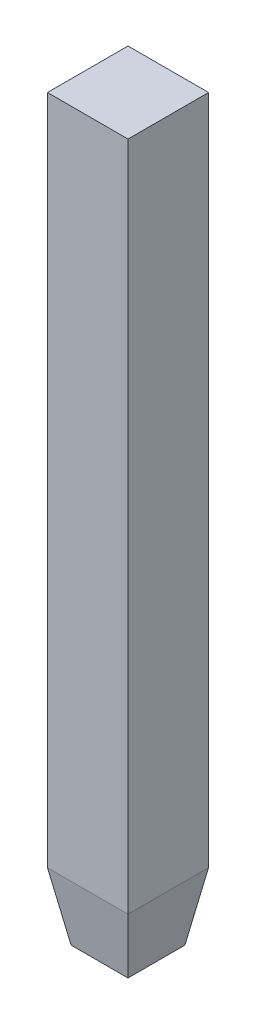
ISO-10303-21;
HEADER;
FILE_DESCRIPTION(('STEP AP214'),'2;1');
FILE_NAME('part.step','',(''),(''),'','','');
FILE_SCHEMA(('AUTOMOTIVE_DESIGN { 1 0 10303 214 1 1 1 1 }'));
ENDSEC;
DATA;
#1=APPLICATION_CONTEXT('core data for automotive mechanical design processes');
#2=APPLICATION_PROTOCOL_DEFINITION('international standard','automotive_design',2000,#1);
#3=PRODUCT_CONTEXT('',#1,'mechanical');
#4=PRODUCT('Part','Part','',(#3));
#5=PRODUCT_RELATED_PRODUCT_CATEGORY('part','',(#4));
#6=PRODUCT_DEFINITION_FORMATION('','',#4);
#7=PRODUCT_DEFINITION_CONTEXT('part definition',#1,'design');
#8=PRODUCT_DEFINITION('design','',#6,#7);
#9=PRODUCT_DEFINITION_SHAPE('','',#8);
#10=(LENGTH_UNIT() NAMED_UNIT(*) SI_UNIT(.MILLI.,.METRE.));
#11=(NAMED_UNIT(*) PLANE_ANGLE_UNIT() SI_UNIT($,.RADIAN.));
#12=(NAMED_UNIT(*) SI_UNIT($,.STERADIAN.) SOLID_ANGLE_UNIT());
#13=UNCERTAINTY_MEASURE_WITH_UNIT(LENGTH_MEASURE(1.E-05),#10,'distance_accuracy_value','');
#14=(GEOMETRIC_REPRESENTATION_CONTEXT(3) GLOBAL_UNCERTAINTY_ASSIGNED_CONTEXT((#13)) GLOBAL_UNIT_ASSIGNED_CONTEXT((#10,
#11,#12)) REPRESENTATION_CONTEXT('',''));
#15=CARTESIAN_POINT('',(0.,0.,0.));
#16=DIRECTION('',(0.,0.,1.));
#17=DIRECTION('',(1.,0.,0.));
#18=AXIS2_PLACEMENT_3D('',#15,#16,#17);
#19=CARTESIAN_POINT('',(9.263525857829,0.5,28.886040012214));
#20=DIRECTION('',(-0.98480775301219,-0.173648177667033,0.));
#21=DIRECTION('',(0.173648177667033,-0.98480775301219,0.));
#22=AXIS2_PLACEMENT_3D('',#19,#20,#21);
#23=PLANE('',#22);
#24=DIRECTION('',(0.17108786974561,-0.970287525247869,-0.171087869746148));
#25=VECTOR('',#24,1.);
#26=CARTESIAN_POINT('',(9.263525857829,0.5,28.886040012214));
#27=LINE('',#26,#25);
#28=CARTESIAN_POINT('',(9.263525857829,0.5,28.886040012214));
#29=VERTEX_POINT('',#28);
#30=CARTESIAN_POINT('',(9.35168934818314,0.,28.7978765218599));
#31=VERTEX_POINT('',#30);
#32=EDGE_CURVE('E66',#29,#31,#27,.T.);
#33=ORIENTED_EDGE('',*,*,#32,.F.);
#34=DIRECTION('',(0.,0.,-1.));
#35=VECTOR('',#34,1.);
#36=CARTESIAN_POINT('',(9.263525857829,0.5,28.886040012214));
#37=LINE('',#36,#35);
#38=CARTESIAN_POINT('',(9.263525857829,0.5,28.286040012214));
#39=VERTEX_POINT('',#38);
#40=EDGE_CURVE('E86',#29,#39,#37,.T.);
#41=ORIENTED_EDGE('',*,*,#40,.T.);
#42=DIRECTION('',(-0.171087869745609,0.970287525247869,-0.171087869746148));
#43=VECTOR('',#42,1.);
#44=CARTESIAN_POINT('',(9.351689348183,0.,28.3742035025683));
#45=LINE('',#44,#43);
#46=CARTESIAN_POINT('',(9.35168934818307,0.,28.3742035025681));
#47=VERTEX_POINT('',#46);
#48=EDGE_CURVE('E83',#47,#39,#45,.T.);
#49=ORIENTED_EDGE('',*,*,#48,.F.);
#50=DIRECTION('',(0.,0.,-1.));
#51=VECTOR('',#50,1.);
#52=CARTESIAN_POINT('',(9.351689348183,0.,0.));
#53=LINE('',#52,#51);
#54=EDGE_CURVE('E20',#31,#47,#53,.T.);
#55=ORIENTED_EDGE('',*,*,#54,.F.);
#56=EDGE_LOOP('',(#33,#41,#49,#55));
#57=FACE_BOUND('',#56,.T.);
#58=ADVANCED_FACE('F17',(#57),#23,.T.);
#59=CARTESIAN_POINT('',(0.,0.,0.));
#60=DIRECTION('',(0.,-1.,0.));
#61=DIRECTION('',(0.,0.,-1.));
#62=AXIS2_PLACEMENT_3D('',#59,#60,#61);
#63=PLANE('',#62);
#64=DIRECTION('',(1.,0.,0.));
#65=VECTOR('',#64,1.);
#66=CARTESIAN_POINT('',(9.263525857829,0.,28.3742035025683));
#67=LINE('',#66,#65);
#68=CARTESIAN_POINT('',(9.77536236747493,0.,28.3742035025681));
#69=VERTEX_POINT('',#68);
#70=EDGE_CURVE('E75',#69,#47,#67,.F.);
#71=ORIENTED_EDGE('',*,*,#70,.F.);
#72=DIRECTION('',(0.,0.,1.));
#73=VECTOR('',#72,1.);
#74=CARTESIAN_POINT('',(9.77536236747472,0.,28.886040012214));
#75=LINE('',#74,#73);
#76=CARTESIAN_POINT('',(9.77536236747493,0.,28.7978765218599));
#77=VERTEX_POINT('',#76);
#78=EDGE_CURVE('E106',#77,#69,#75,.F.);
#79=ORIENTED_EDGE('',*,*,#78,.F.);
#80=DIRECTION('',(1.,0.,0.));
#81=VECTOR('',#80,1.);
#82=CARTESIAN_POINT('',(9.263525857829,0.,28.7978765218597));
#83=LINE('',#82,#81);
#84=EDGE_CURVE('E77',#31,#77,#83,.T.);
#85=ORIENTED_EDGE('',*,*,#84,.F.);
#86=ORIENTED_EDGE('',*,*,#54,.T.);
#87=EDGE_LOOP('',(#71,#79,#85,#86));
#88=FACE_BOUND('',#87,.T.);
#89=ADVANCED_FACE('F73',(#88),#63,.T.);
#90=CARTESIAN_POINT('',(9.263525857829,0.5,28.286040012214));
#91=DIRECTION('',(0.,-0.173648177667033,-0.98480775301219));
#92=DIRECTION('',(0.,0.98480775301219,-0.173648177667033));
#93=AXIS2_PLACEMENT_3D('',#90,#91,#92);
#94=PLANE('',#93);
#95=ORIENTED_EDGE('',*,*,#48,.T.);
#96=DIRECTION('',(1.,0.,0.));
#97=VECTOR('',#96,1.);
#98=CARTESIAN_POINT('',(9.263525857829,0.5,28.286040012214));
#99=LINE('',#98,#97);
#100=CARTESIAN_POINT('',(9.863525857829,0.5,28.286040012214));
#101=VERTEX_POINT('',#100);
#102=EDGE_CURVE('E101',#39,#101,#99,.T.);
#103=ORIENTED_EDGE('',*,*,#102,.T.);
#104=DIRECTION('',(0.171087869746151,0.970287525247868,-0.171087869745616));
#105=VECTOR('',#104,1.);
#106=CARTESIAN_POINT('',(9.77536236747472,0.,28.374203502568));
#107=LINE('',#106,#105);
#108=EDGE_CURVE('E85',#69,#101,#107,.T.);
#109=ORIENTED_EDGE('',*,*,#108,.F.);
#110=ORIENTED_EDGE('',*,*,#70,.T.);
#111=EDGE_LOOP('',(#95,#103,#109,#110));
#112=FACE_BOUND('',#111,.T.);
#113=ADVANCED_FACE('F81',(#112),#94,.T.);
#114=CARTESIAN_POINT('',(9.263525857829,0.5,28.886040012214));
#115=DIRECTION('',(0.,-0.173648177667033,0.98480775301219));
#116=DIRECTION('',(0.,-0.98480775301219,-0.173648177667033));
#117=AXIS2_PLACEMENT_3D('',#114,#115,#116);
#118=PLANE('',#117);
#119=ORIENTED_EDGE('',*,*,#32,.T.);
#120=ORIENTED_EDGE('',*,*,#84,.T.);
#121=DIRECTION('',(-0.171087869746151,-0.97028752524787,-0.171087869745603));
#122=VECTOR('',#121,1.);
#123=CARTESIAN_POINT('',(9.863525857829,0.5,28.886040012214));
#124=LINE('',#123,#122);
#125=CARTESIAN_POINT('',(9.863525857829,0.5,28.886040012214));
#126=VERTEX_POINT('',#125);
#127=EDGE_CURVE('E103',#126,#77,#124,.T.);
#128=ORIENTED_EDGE('',*,*,#127,.F.);
#129=DIRECTION('',(-1.,0.,0.));
#130=VECTOR('',#129,1.);
#131=CARTESIAN_POINT('',(9.263525857829,0.5,28.886040012214));
#132=LINE('',#131,#130);
#133=EDGE_CURVE('E34',#126,#29,#132,.T.);
#134=ORIENTED_EDGE('',*,*,#133,.T.);
#135=EDGE_LOOP('',(#119,#120,#128,#134));
#136=FACE_BOUND('',#135,.T.);
#137=ADVANCED_FACE('F154',(#136),#118,.T.);
#138=CARTESIAN_POINT('',(9.263525857829,5.5,28.886040012214));
#139=DIRECTION('',(1.,0.,0.));
#140=DIRECTION('',(0.,0.,-1.));
#141=AXIS2_PLACEMENT_3D('',#138,#139,#140);
#142=PLANE('',#141);
#143=ORIENTED_EDGE('',*,*,#40,.F.);
#144=DIRECTION('',(0.,1.,0.));
#145=VECTOR('',#144,1.);
#146=CARTESIAN_POINT('',(9.263525857829,5.5,28.886040012214));
#147=LINE('',#146,#145);
#148=CARTESIAN_POINT('',(9.263525857829,5.5,28.886040012214));
#149=VERTEX_POINT('',#148);
#150=EDGE_CURVE('E113',#29,#149,#147,.T.);
#151=ORIENTED_EDGE('',*,*,#150,.T.);
#152=DIRECTION('',(0.,0.,-1.));
#153=VECTOR('',#152,1.);
#154=CARTESIAN_POINT('',(9.263525857829,5.5,0.));
#155=LINE('',#154,#153);
#156=CARTESIAN_POINT('',(9.263525857829,5.5,28.286040012214));
#157=VERTEX_POINT('',#156);
#158=EDGE_CURVE('E93',#149,#157,#155,.T.);
#159=ORIENTED_EDGE('',*,*,#158,.T.);
#160=DIRECTION('',(0.,1.,0.));
#161=VECTOR('',#160,1.);
#162=CARTESIAN_POINT('',(9.263525857829,5.5,28.286040012214));
#163=LINE('',#162,#161);
#164=EDGE_CURVE('E98',#157,#39,#163,.F.);
#165=ORIENTED_EDGE('',*,*,#164,.T.);
#166=EDGE_LOOP('',(#143,#151,#159,#165));
#167=FACE_BOUND('',#166,.T.);
#168=ADVANCED_FACE('F151',(#167),#142,.F.);
#169=CARTESIAN_POINT('',(0.,5.5,0.));
#170=DIRECTION('',(0.,-1.,0.));
#171=DIRECTION('',(0.,0.,-1.));
#172=AXIS2_PLACEMENT_3D('',#169,#170,#171);
#173=PLANE('',#172);
#174=DIRECTION('',(1.,0.,0.));
#175=VECTOR('',#174,1.);
#176=CARTESIAN_POINT('',(9.263525857829,5.5,28.286040012214));
#177=LINE('',#176,#175);
#178=CARTESIAN_POINT('',(9.863525857829,5.5,28.286040012214));
#179=VERTEX_POINT('',#178);
#180=EDGE_CURVE('E95',#179,#157,#177,.F.);
#181=ORIENTED_EDGE('',*,*,#180,.T.);
#182=ORIENTED_EDGE('',*,*,#158,.F.);
#183=DIRECTION('',(-1.,0.,0.));
#184=VECTOR('',#183,1.);
#185=CARTESIAN_POINT('',(9.263525857829,5.5,28.886040012214));
#186=LINE('',#185,#184);
#187=CARTESIAN_POINT('',(9.863525857829,5.5,28.886040012214));
#188=VERTEX_POINT('',#187);
#189=EDGE_CURVE('E109',#149,#188,#186,.F.);
#190=ORIENTED_EDGE('',*,*,#189,.T.);
#191=DIRECTION('',(0.,0.,1.));
#192=VECTOR('',#191,1.);
#193=CARTESIAN_POINT('',(9.863525857829,5.5,28.886040012214));
#194=LINE('',#193,#192);
#195=EDGE_CURVE('E116',#188,#179,#194,.F.);
#196=ORIENTED_EDGE('',*,*,#195,.T.);
#197=EDGE_LOOP('',(#181,#182,#190,#196));
#198=FACE_BOUND('',#197,.T.);
#199=ADVANCED_FACE('F134',(#198),#173,.F.);
#200=CARTESIAN_POINT('',(9.263525857829,5.5,28.286040012214));
#201=DIRECTION('',(0.,0.,1.));
#202=DIRECTION('',(1.,0.,0.));
#203=AXIS2_PLACEMENT_3D('',#200,#201,#202);
#204=PLANE('',#203);
#205=ORIENTED_EDGE('',*,*,#102,.F.);
#206=ORIENTED_EDGE('',*,*,#164,.F.);
#207=ORIENTED_EDGE('',*,*,#180,.F.);
#208=DIRECTION('',(0.,1.,0.));
#209=VECTOR('',#208,1.);
#210=CARTESIAN_POINT('',(9.863525857829,5.5,28.286040012214));
#211=LINE('',#210,#209);
#212=EDGE_CURVE('E119',#179,#101,#211,.F.);
#213=ORIENTED_EDGE('',*,*,#212,.T.);
#214=EDGE_LOOP('',(#205,#206,#207,#213));
#215=FACE_BOUND('',#214,.T.);
#216=ADVANCED_FACE('F131',(#215),#204,.F.);
#217=CARTESIAN_POINT('',(9.863525857829,0.5,28.886040012214));
#218=DIRECTION('',(0.98480775301219,-0.173648177667033,0.));
#219=DIRECTION('',(0.173648177667033,0.98480775301219,0.));
#220=AXIS2_PLACEMENT_3D('',#217,#218,#219);
#221=PLANE('',#220);
#222=ORIENTED_EDGE('',*,*,#108,.T.);
#223=DIRECTION('',(0.,0.,1.));
#224=VECTOR('',#223,1.);
#225=CARTESIAN_POINT('',(9.863525857829,0.5,28.886040012214));
#226=LINE('',#225,#224);
#227=EDGE_CURVE('E26',#101,#126,#226,.T.);
#228=ORIENTED_EDGE('',*,*,#227,.T.);
#229=ORIENTED_EDGE('',*,*,#127,.T.);
#230=ORIENTED_EDGE('',*,*,#78,.T.);
#231=EDGE_LOOP('',(#222,#228,#229,#230));
#232=FACE_BOUND('',#231,.T.);
#233=ADVANCED_FACE('F125',(#232),#221,.T.);
#234=CARTESIAN_POINT('',(9.263525857829,5.5,28.886040012214));
#235=DIRECTION('',(0.,0.,-1.));
#236=DIRECTION('',(-1.,0.,0.));
#237=AXIS2_PLACEMENT_3D('',#234,#235,#236);
#238=PLANE('',#237);
#239=ORIENTED_EDGE('',*,*,#133,.F.);
#240=DIRECTION('',(0.,1.,0.));
#241=VECTOR('',#240,1.);
#242=CARTESIAN_POINT('',(9.863525857829,5.5,28.886040012214));
#243=LINE('',#242,#241);
#244=EDGE_CURVE('E11',#126,#188,#243,.T.);
#245=ORIENTED_EDGE('',*,*,#244,.T.);
#246=ORIENTED_EDGE('',*,*,#189,.F.);
#247=ORIENTED_EDGE('',*,*,#150,.F.);
#248=EDGE_LOOP('',(#239,#245,#246,#247));
#249=FACE_BOUND('',#248,.T.);
#250=ADVANCED_FACE('F136',(#249),#238,.F.);
#251=CARTESIAN_POINT('',(9.863525857829,5.5,28.886040012214));
#252=DIRECTION('',(-1.,0.,0.));
#253=DIRECTION('',(0.,0.,1.));
#254=AXIS2_PLACEMENT_3D('',#251,#252,#253);
#255=PLANE('',#254);
#256=ORIENTED_EDGE('',*,*,#227,.F.);
#257=ORIENTED_EDGE('',*,*,#212,.F.);
#258=ORIENTED_EDGE('',*,*,#195,.F.);
#259=ORIENTED_EDGE('',*,*,#244,.F.);
#260=EDGE_LOOP('',(#256,#257,#258,#259));
#261=FACE_BOUND('',#260,.T.);
#262=ADVANCED_FACE('F129',(#261),#255,.F.);
#263=CLOSED_SHELL('',(#58,#89,#113,#137,#168,#199,#216,#233,#250,#262));
#264=MANIFOLD_SOLID_BREP('B1',#263);
#265=ADVANCED_BREP_SHAPE_REPRESENTATION('',(#18,#264),#14);
#266=SHAPE_DEFINITION_REPRESENTATION(#9,#265);
ENDSEC;
END-ISO-10303-21;
